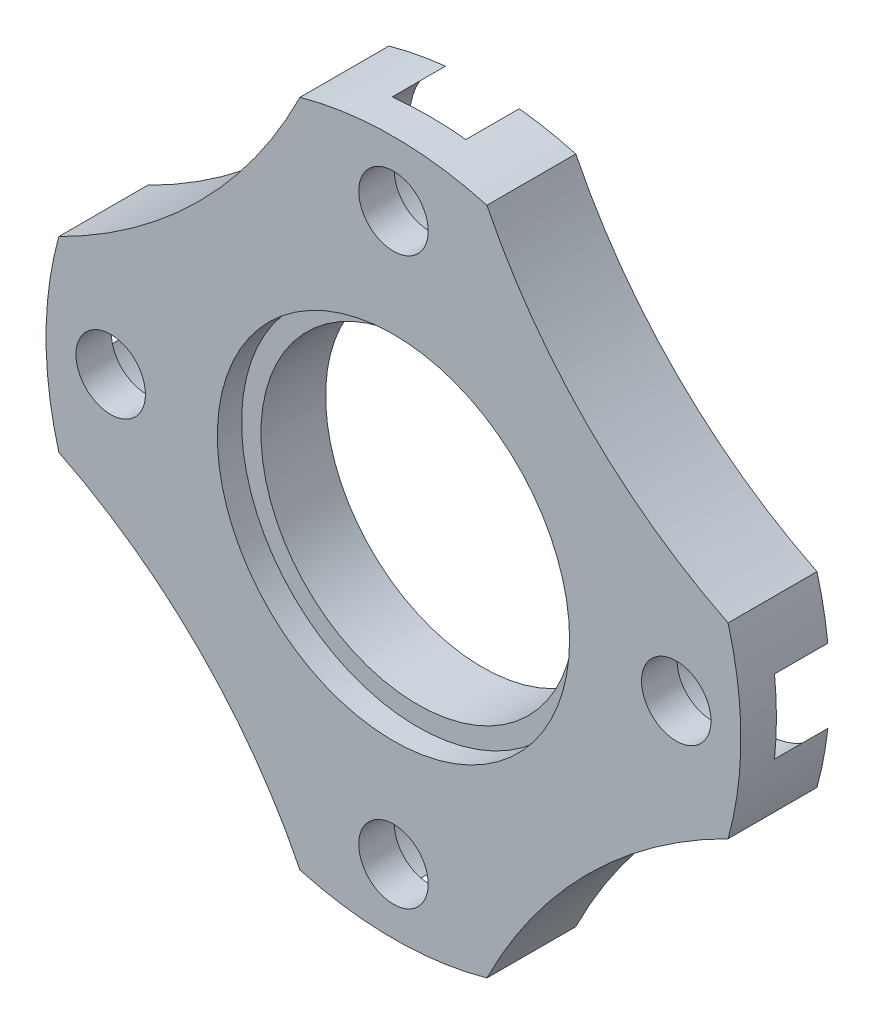
ISO-10303-21;
HEADER;
FILE_DESCRIPTION(('STEP AP214'),'2;1');
FILE_NAME('part.step','',(''),(''),'','','');
FILE_SCHEMA(('AUTOMOTIVE_DESIGN { 1 0 10303 214 1 1 1 1 }'));
ENDSEC;
DATA;
#1=APPLICATION_CONTEXT('core data for automotive mechanical design processes');
#2=APPLICATION_PROTOCOL_DEFINITION('international standard','automotive_design',2000,#1);
#3=PRODUCT_CONTEXT('',#1,'mechanical');
#4=PRODUCT('Part','Part','',(#3));
#5=PRODUCT_RELATED_PRODUCT_CATEGORY('part','',(#4));
#6=PRODUCT_DEFINITION_FORMATION('','',#4);
#7=PRODUCT_DEFINITION_CONTEXT('part definition',#1,'design');
#8=PRODUCT_DEFINITION('design','',#6,#7);
#9=PRODUCT_DEFINITION_SHAPE('','',#8);
#10=(LENGTH_UNIT() NAMED_UNIT(*) SI_UNIT(.MILLI.,.METRE.));
#11=(NAMED_UNIT(*) PLANE_ANGLE_UNIT() SI_UNIT($,.RADIAN.));
#12=(NAMED_UNIT(*) SI_UNIT($,.STERADIAN.) SOLID_ANGLE_UNIT());
#13=UNCERTAINTY_MEASURE_WITH_UNIT(LENGTH_MEASURE(1.E-05),#10,'distance_accuracy_value','');
#14=(GEOMETRIC_REPRESENTATION_CONTEXT(3) GLOBAL_UNCERTAINTY_ASSIGNED_CONTEXT((#13)) GLOBAL_UNIT_ASSIGNED_CONTEXT((#10,
#11,#12)) REPRESENTATION_CONTEXT('',''));
#15=CARTESIAN_POINT('',(0.,0.,0.));
#16=DIRECTION('',(0.,0.,1.));
#17=DIRECTION('',(1.,0.,0.));
#18=AXIS2_PLACEMENT_3D('',#15,#16,#17);
#19=CARTESIAN_POINT('',(0.,17.5,5.5));
#20=DIRECTION('',(0.,0.,-1.));
#21=DIRECTION('',(-1.,0.,0.));
#22=AXIS2_PLACEMENT_3D('',#19,#20,#21);
#23=CYLINDRICAL_SURFACE('',#22,2.15);
#24=CARTESIAN_POINT('',(0.,17.5,5.5));
#25=DIRECTION('',(0.,0.,1.));
#26=DIRECTION('',(1.,0.,0.));
#27=AXIS2_PLACEMENT_3D('',#24,#25,#26);
#28=CIRCLE('',#27,2.15);
#29=CARTESIAN_POINT('',(2.15,17.5,5.5));
#30=VERTEX_POINT('',#29);
#31=EDGE_CURVE('E190',#30,#30,#28,.T.);
#32=ORIENTED_EDGE('',*,*,#31,.T.);
#33=EDGE_LOOP('',(#32));
#34=FACE_BOUND('',#33,.T.);
#35=CARTESIAN_POINT('',(0.,17.5,3.3));
#36=DIRECTION('',(0.,0.,-1.));
#37=DIRECTION('',(-1.,0.,0.));
#38=AXIS2_PLACEMENT_3D('',#35,#36,#37);
#39=CIRCLE('',#38,2.15);
#40=CARTESIAN_POINT('',(-2.15,17.5,3.3));
#41=VERTEX_POINT('',#40);
#42=EDGE_CURVE('E297',#41,#41,#39,.T.);
#43=ORIENTED_EDGE('',*,*,#42,.T.);
#44=EDGE_LOOP('',(#43));
#45=FACE_BOUND('',#44,.T.);
#46=ADVANCED_FACE('F34',(#34,#45),#23,.F.);
#47=CARTESIAN_POINT('',(17.5,0.,5.5));
#48=DIRECTION('',(0.,0.,-1.));
#49=DIRECTION('',(-1.,0.,0.));
#50=AXIS2_PLACEMENT_3D('',#47,#48,#49);
#51=CYLINDRICAL_SURFACE('',#50,2.15);
#52=CARTESIAN_POINT('',(17.5,0.,5.5));
#53=DIRECTION('',(0.,0.,1.));
#54=DIRECTION('',(1.,0.,0.));
#55=AXIS2_PLACEMENT_3D('',#52,#53,#54);
#56=CIRCLE('',#55,2.15);
#57=CARTESIAN_POINT('',(19.65,0.,5.5));
#58=VERTEX_POINT('',#57);
#59=EDGE_CURVE('E197',#58,#58,#56,.T.);
#60=ORIENTED_EDGE('',*,*,#59,.T.);
#61=EDGE_LOOP('',(#60));
#62=FACE_BOUND('',#61,.T.);
#63=CARTESIAN_POINT('',(17.5,0.,3.3));
#64=DIRECTION('',(0.,0.,-1.));
#65=DIRECTION('',(-1.,0.,0.));
#66=AXIS2_PLACEMENT_3D('',#63,#64,#65);
#67=CIRCLE('',#66,2.15);
#68=CARTESIAN_POINT('',(15.35,0.,3.3));
#69=VERTEX_POINT('',#68);
#70=EDGE_CURVE('E294',#69,#69,#67,.T.);
#71=ORIENTED_EDGE('',*,*,#70,.T.);
#72=EDGE_LOOP('',(#71));
#73=FACE_BOUND('',#72,.T.);
#74=ADVANCED_FACE('F336',(#62,#73),#51,.F.);
#75=CARTESIAN_POINT('',(-17.5,0.,5.5));
#76=DIRECTION('',(0.,0.,-1.));
#77=DIRECTION('',(-1.,0.,0.));
#78=AXIS2_PLACEMENT_3D('',#75,#76,#77);
#79=CYLINDRICAL_SURFACE('',#78,2.15);
#80=CARTESIAN_POINT('',(-17.5,0.,5.5));
#81=DIRECTION('',(0.,0.,1.));
#82=DIRECTION('',(1.,0.,0.));
#83=AXIS2_PLACEMENT_3D('',#80,#81,#82);
#84=CIRCLE('',#83,2.15);
#85=CARTESIAN_POINT('',(-15.35,0.,5.5));
#86=VERTEX_POINT('',#85);
#87=EDGE_CURVE('E249',#86,#86,#84,.T.);
#88=ORIENTED_EDGE('',*,*,#87,.T.);
#89=EDGE_LOOP('',(#88));
#90=FACE_BOUND('',#89,.T.);
#91=CARTESIAN_POINT('',(-17.5,0.,3.3));
#92=DIRECTION('',(0.,0.,-1.));
#93=DIRECTION('',(-1.,0.,0.));
#94=AXIS2_PLACEMENT_3D('',#91,#92,#93);
#95=CIRCLE('',#94,2.15);
#96=CARTESIAN_POINT('',(-19.65,0.,3.3));
#97=VERTEX_POINT('',#96);
#98=EDGE_CURVE('E290',#97,#97,#95,.T.);
#99=ORIENTED_EDGE('',*,*,#98,.T.);
#100=EDGE_LOOP('',(#99));
#101=FACE_BOUND('',#100,.T.);
#102=ADVANCED_FACE('F342',(#90,#101),#79,.F.);
#103=CARTESIAN_POINT('',(0.,-17.5,5.5));
#104=DIRECTION('',(0.,0.,-1.));
#105=DIRECTION('',(-1.,0.,0.));
#106=AXIS2_PLACEMENT_3D('',#103,#104,#105);
#107=CYLINDRICAL_SURFACE('',#106,2.15);
#108=CARTESIAN_POINT('',(0.,-17.5,5.5));
#109=DIRECTION('',(0.,0.,1.));
#110=DIRECTION('',(1.,0.,0.));
#111=AXIS2_PLACEMENT_3D('',#108,#109,#110);
#112=CIRCLE('',#111,2.15);
#113=CARTESIAN_POINT('',(2.15,-17.5,5.5));
#114=VERTEX_POINT('',#113);
#115=EDGE_CURVE('E246',#114,#114,#112,.T.);
#116=ORIENTED_EDGE('',*,*,#115,.T.);
#117=EDGE_LOOP('',(#116));
#118=FACE_BOUND('',#117,.T.);
#119=CARTESIAN_POINT('',(0.,-17.5,3.3));
#120=DIRECTION('',(0.,0.,-1.));
#121=DIRECTION('',(-1.,0.,0.));
#122=AXIS2_PLACEMENT_3D('',#119,#120,#121);
#123=CIRCLE('',#122,2.15);
#124=CARTESIAN_POINT('',(-2.15,-17.5,3.3));
#125=VERTEX_POINT('',#124);
#126=EDGE_CURVE('E291',#125,#125,#123,.T.);
#127=ORIENTED_EDGE('',*,*,#126,.T.);
#128=EDGE_LOOP('',(#127));
#129=FACE_BOUND('',#128,.T.);
#130=ADVANCED_FACE('F362',(#118,#129),#107,.F.);
#131=CARTESIAN_POINT('',(0.,0.,5.5));
#132=DIRECTION('',(0.,0.,-1.));
#133=DIRECTION('',(-1.,0.,0.));
#134=AXIS2_PLACEMENT_3D('',#131,#132,#133);
#135=CYLINDRICAL_SURFACE('',#134,21.5);
#136=CARTESIAN_POINT('',(0.,0.,0.));
#137=DIRECTION('',(0.,0.,1.));
#138=DIRECTION('',(1.,0.,0.));
#139=AXIS2_PLACEMENT_3D('',#136,#137,#138);
#140=CIRCLE('',#139,21.5);
#141=CARTESIAN_POINT('',(20.7072263078309,-5.78452924932317,0.));
#142=VERTEX_POINT('',#141);
#143=CARTESIAN_POINT('',(21.3785714285714,-2.28181587194702,0.));
#144=VERTEX_POINT('',#143);
#145=EDGE_CURVE('E173',#142,#144,#140,.T.);
#146=ORIENTED_EDGE('',*,*,#145,.T.);
#147=DIRECTION('',(0.,0.,-1.));
#148=VECTOR('',#147,1.);
#149=CARTESIAN_POINT('',(21.3785714285714,-2.28181587194703,1.65));
#150=LINE('',#149,#148);
#151=CARTESIAN_POINT('',(21.3785714285714,-2.28181587194704,3.3));
#152=VERTEX_POINT('',#151);
#153=EDGE_CURVE('E57',#144,#152,#150,.F.);
#154=ORIENTED_EDGE('',*,*,#153,.T.);
#155=CARTESIAN_POINT('',(0.,0.,3.3));
#156=DIRECTION('',(0.,0.,-1.));
#157=DIRECTION('',(-1.,0.,0.));
#158=AXIS2_PLACEMENT_3D('',#155,#156,#157);
#159=CIRCLE('',#158,21.5);
#160=CARTESIAN_POINT('',(21.3785714285714,2.28181587194704,3.3));
#161=VERTEX_POINT('',#160);
#162=EDGE_CURVE('E295',#161,#152,#159,.T.);
#163=ORIENTED_EDGE('',*,*,#162,.F.);
#164=DIRECTION('',(0.,0.,-1.));
#165=VECTOR('',#164,1.);
#166=CARTESIAN_POINT('',(21.3785714285714,2.28181587194703,1.65));
#167=LINE('',#166,#165);
#168=CARTESIAN_POINT('',(21.3785714285714,2.28181587194703,0.));
#169=VERTEX_POINT('',#168);
#170=EDGE_CURVE('E300',#161,#169,#167,.T.);
#171=ORIENTED_EDGE('',*,*,#170,.T.);
#172=CARTESIAN_POINT('',(20.707226307831,5.78452924932302,0.));
#173=VERTEX_POINT('',#172);
#174=EDGE_CURVE('E179',#169,#173,#140,.T.);
#175=ORIENTED_EDGE('',*,*,#174,.T.);
#176=DIRECTION('',(0.,0.,1.));
#177=VECTOR('',#176,1.);
#178=CARTESIAN_POINT('',(20.707226307831,5.78452924932302,0.));
#179=LINE('',#178,#177);
#180=CARTESIAN_POINT('',(20.707226307831,5.78452924932302,5.5));
#181=VERTEX_POINT('',#180);
#182=EDGE_CURVE('E232',#173,#181,#179,.T.);
#183=ORIENTED_EDGE('',*,*,#182,.T.);
#184=CARTESIAN_POINT('',(0.,0.,5.5));
#185=DIRECTION('',(0.,0.,1.));
#186=DIRECTION('',(1.,0.,0.));
#187=AXIS2_PLACEMENT_3D('',#184,#185,#186);
#188=CIRCLE('',#187,21.5);
#189=CARTESIAN_POINT('',(20.7072263078309,-5.78452924932317,5.5));
#190=VERTEX_POINT('',#189);
#191=EDGE_CURVE('E188',#190,#181,#188,.T.);
#192=ORIENTED_EDGE('',*,*,#191,.F.);
#193=DIRECTION('',(0.,0.,1.));
#194=VECTOR('',#193,1.);
#195=CARTESIAN_POINT('',(20.7072263078309,-5.78452924932317,0.));
#196=LINE('',#195,#194);
#197=EDGE_CURVE('E229',#142,#190,#196,.T.);
#198=ORIENTED_EDGE('',*,*,#197,.F.);
#199=EDGE_LOOP('',(#146,#154,#163,#171,#175,#183,#192,#198));
#200=FACE_BOUND('',#199,.T.);
#201=ADVANCED_FACE('F355',(#200),#135,.T.);
#202=CARTESIAN_POINT('',(-20.707226307831,5.784529249323,0.));
#203=VERTEX_POINT('',#202);
#204=CARTESIAN_POINT('',(-21.3785714285714,2.28181587194702,0.));
#205=VERTEX_POINT('',#204);
#206=EDGE_CURVE('E177',#203,#205,#140,.T.);
#207=ORIENTED_EDGE('',*,*,#206,.T.);
#208=DIRECTION('',(0.,0.,-1.));
#209=VECTOR('',#208,1.);
#210=CARTESIAN_POINT('',(-21.3785714285714,2.28181587194702,1.65));
#211=LINE('',#210,#209);
#212=CARTESIAN_POINT('',(-21.3785714285714,2.28181587194704,3.3));
#213=VERTEX_POINT('',#212);
#214=EDGE_CURVE('E49',#205,#213,#211,.F.);
#215=ORIENTED_EDGE('',*,*,#214,.T.);
#216=CARTESIAN_POINT('',(0.,0.,3.3));
#217=DIRECTION('',(0.,0.,-1.));
#218=DIRECTION('',(-1.,0.,0.));
#219=AXIS2_PLACEMENT_3D('',#216,#217,#218);
#220=CIRCLE('',#219,21.5);
#221=CARTESIAN_POINT('',(-21.3785714285714,-2.28181587194704,3.3));
#222=VERTEX_POINT('',#221);
#223=EDGE_CURVE('E292',#222,#213,#220,.T.);
#224=ORIENTED_EDGE('',*,*,#223,.F.);
#225=DIRECTION('',(0.,0.,-1.));
#226=VECTOR('',#225,1.);
#227=CARTESIAN_POINT('',(-21.3785714285714,-2.28181587194703,1.65));
#228=LINE('',#227,#226);
#229=CARTESIAN_POINT('',(-21.3785714285714,-2.28181587194703,0.));
#230=VERTEX_POINT('',#229);
#231=EDGE_CURVE('E209',#222,#230,#228,.T.);
#232=ORIENTED_EDGE('',*,*,#231,.T.);
#233=CARTESIAN_POINT('',(-20.707226307831,-5.78452924932287,0.));
#234=VERTEX_POINT('',#233);
#235=EDGE_CURVE('E176',#230,#234,#140,.T.);
#236=ORIENTED_EDGE('',*,*,#235,.T.);
#237=DIRECTION('',(0.,0.,1.));
#238=VECTOR('',#237,1.);
#239=CARTESIAN_POINT('',(-20.707226307831,-5.78452924932287,0.));
#240=LINE('',#239,#238);
#241=CARTESIAN_POINT('',(-20.707226307831,-5.78452924932287,5.5));
#242=VERTEX_POINT('',#241);
#243=EDGE_CURVE('E206',#234,#242,#240,.T.);
#244=ORIENTED_EDGE('',*,*,#243,.T.);
#245=CARTESIAN_POINT('',(-20.707226307831,5.78452924932301,5.5));
#246=VERTEX_POINT('',#245);
#247=EDGE_CURVE('E260',#246,#242,#188,.T.);
#248=ORIENTED_EDGE('',*,*,#247,.F.);
#249=DIRECTION('',(0.,0.,1.));
#250=VECTOR('',#249,1.);
#251=CARTESIAN_POINT('',(-20.707226307831,5.78452924932301,0.));
#252=LINE('',#251,#250);
#253=EDGE_CURVE('E269',#203,#246,#252,.T.);
#254=ORIENTED_EDGE('',*,*,#253,.F.);
#255=EDGE_LOOP('',(#207,#215,#224,#232,#236,#244,#248,#254));
#256=FACE_BOUND('',#255,.T.);
#257=ADVANCED_FACE('F204',(#256),#135,.T.);
#258=CARTESIAN_POINT('',(5.78452924932308,20.7072263078309,0.));
#259=VERTEX_POINT('',#258);
#260=CARTESIAN_POINT('',(2.28181587194702,21.3785714285714,0.));
#261=VERTEX_POINT('',#260);
#262=EDGE_CURVE('E180',#259,#261,#140,.T.);
#263=ORIENTED_EDGE('',*,*,#262,.T.);
#264=DIRECTION('',(0.,0.,-1.));
#265=VECTOR('',#264,1.);
#266=CARTESIAN_POINT('',(2.28181587194703,21.3785714285714,1.65));
#267=LINE('',#266,#265);
#268=CARTESIAN_POINT('',(2.28181587194704,21.3785714285714,3.3));
#269=VERTEX_POINT('',#268);
#270=EDGE_CURVE('E307',#261,#269,#267,.F.);
#271=ORIENTED_EDGE('',*,*,#270,.T.);
#272=CARTESIAN_POINT('',(0.,0.,3.3));
#273=DIRECTION('',(0.,0.,-1.));
#274=DIRECTION('',(-1.,0.,0.));
#275=AXIS2_PLACEMENT_3D('',#272,#273,#274);
#276=CIRCLE('',#275,21.5);
#277=CARTESIAN_POINT('',(-2.28181587194704,21.3785714285714,3.3));
#278=VERTEX_POINT('',#277);
#279=EDGE_CURVE('E298',#278,#269,#276,.T.);
#280=ORIENTED_EDGE('',*,*,#279,.F.);
#281=DIRECTION('',(0.,0.,-1.));
#282=VECTOR('',#281,1.);
#283=CARTESIAN_POINT('',(-2.28181587194703,21.3785714285714,1.65));
#284=LINE('',#283,#282);
#285=CARTESIAN_POINT('',(-2.28181587194703,21.3785714285714,0.));
#286=VERTEX_POINT('',#285);
#287=EDGE_CURVE('E305',#278,#286,#284,.T.);
#288=ORIENTED_EDGE('',*,*,#287,.T.);
#289=CARTESIAN_POINT('',(-5.78452924932309,20.7072263078309,0.));
#290=VERTEX_POINT('',#289);
#291=EDGE_CURVE('E175',#286,#290,#140,.T.);
#292=ORIENTED_EDGE('',*,*,#291,.T.);
#293=DIRECTION('',(0.,0.,1.));
#294=VECTOR('',#293,1.);
#295=CARTESIAN_POINT('',(-5.78452924932309,20.7072263078309,0.));
#296=LINE('',#295,#294);
#297=CARTESIAN_POINT('',(-5.78452924932309,20.7072263078309,5.5));
#298=VERTEX_POINT('',#297);
#299=EDGE_CURVE('E222',#290,#298,#296,.T.);
#300=ORIENTED_EDGE('',*,*,#299,.T.);
#301=CARTESIAN_POINT('',(5.78452924932309,20.7072263078309,5.5));
#302=VERTEX_POINT('',#301);
#303=EDGE_CURVE('E165',#302,#298,#188,.T.);
#304=ORIENTED_EDGE('',*,*,#303,.F.);
#305=DIRECTION('',(0.,0.,1.));
#306=VECTOR('',#305,1.);
#307=CARTESIAN_POINT('',(5.78452924932309,20.7072263078309,0.));
#308=LINE('',#307,#306);
#309=EDGE_CURVE('E225',#259,#302,#308,.T.);
#310=ORIENTED_EDGE('',*,*,#309,.F.);
#311=EDGE_LOOP('',(#263,#271,#280,#288,#292,#300,#304,#310));
#312=FACE_BOUND('',#311,.T.);
#313=ADVANCED_FACE('F320',(#312),#135,.T.);
#314=CARTESIAN_POINT('',(0.,0.,5.5));
#315=DIRECTION('',(0.,0.,-1.));
#316=DIRECTION('',(-1.,0.,0.));
#317=AXIS2_PLACEMENT_3D('',#314,#315,#316);
#318=CYLINDRICAL_SURFACE('',#317,9.7);
#319=CARTESIAN_POINT('',(0.,0.,0.));
#320=DIRECTION('',(0.,0.,1.));
#321=DIRECTION('',(1.,0.,0.));
#322=AXIS2_PLACEMENT_3D('',#319,#320,#321);
#323=CIRCLE('',#322,9.7);
#324=CARTESIAN_POINT('',(9.7,0.,0.));
#325=VERTEX_POINT('',#324);
#326=EDGE_CURVE('E243',#325,#325,#323,.T.);
#327=ORIENTED_EDGE('',*,*,#326,.F.);
#328=EDGE_LOOP('',(#327));
#329=FACE_BOUND('',#328,.T.);
#330=CARTESIAN_POINT('',(0.,0.,4.));
#331=DIRECTION('',(0.,0.,1.));
#332=DIRECTION('',(1.,0.,0.));
#333=AXIS2_PLACEMENT_3D('',#330,#331,#332);
#334=CIRCLE('',#333,9.7);
#335=CARTESIAN_POINT('',(9.7,0.,4.));
#336=VERTEX_POINT('',#335);
#337=EDGE_CURVE('E240',#336,#336,#334,.T.);
#338=ORIENTED_EDGE('',*,*,#337,.T.);
#339=EDGE_LOOP('',(#338));
#340=FACE_BOUND('',#339,.T.);
#341=ADVANCED_FACE('F349',(#329,#340),#318,.F.);
#342=CARTESIAN_POINT('',(0.,0.,5.5));
#343=DIRECTION('',(0.,0.,1.));
#344=DIRECTION('',(1.,0.,0.));
#345=AXIS2_PLACEMENT_3D('',#342,#343,#344);
#346=PLANE('',#345);
#347=CARTESIAN_POINT('',(35.3553390593274,35.3553390593273,5.5));
#348=DIRECTION('',(0.,0.,1.));
#349=DIRECTION('',(1.,0.,0.));
#350=AXIS2_PLACEMENT_3D('',#347,#348,#349);
#351=CIRCLE('',#350,33.);
#352=EDGE_CURVE('E217',#302,#181,#351,.T.);
#353=ORIENTED_EDGE('',*,*,#352,.F.);
#354=ORIENTED_EDGE('',*,*,#303,.T.);
#355=CARTESIAN_POINT('',(-35.3553390593274,35.3553390593273,5.5));
#356=DIRECTION('',(0.,0.,1.));
#357=DIRECTION('',(1.,0.,0.));
#358=AXIS2_PLACEMENT_3D('',#355,#356,#357);
#359=CIRCLE('',#358,33.);
#360=EDGE_CURVE('E267',#246,#298,#359,.T.);
#361=ORIENTED_EDGE('',*,*,#360,.F.);
#362=ORIENTED_EDGE('',*,*,#247,.T.);
#363=CARTESIAN_POINT('',(-35.3553390593277,-35.3553390593271,5.5));
#364=DIRECTION('',(0.,0.,1.));
#365=DIRECTION('',(1.,0.,0.));
#366=AXIS2_PLACEMENT_3D('',#363,#364,#365);
#367=CIRCLE('',#366,33.);
#368=CARTESIAN_POINT('',(-5.78452924932322,-20.7072263078309,5.5));
#369=VERTEX_POINT('',#368);
#370=EDGE_CURVE('E216',#369,#242,#367,.T.);
#371=ORIENTED_EDGE('',*,*,#370,.F.);
#372=CARTESIAN_POINT('',(5.78452924932297,-20.707226307831,5.5));
#373=VERTEX_POINT('',#372);
#374=EDGE_CURVE('E254',#369,#373,#188,.T.);
#375=ORIENTED_EDGE('',*,*,#374,.T.);
#376=CARTESIAN_POINT('',(35.3553390593272,-35.3553390593276,5.5));
#377=DIRECTION('',(0.,0.,1.));
#378=DIRECTION('',(1.,0.,0.));
#379=AXIS2_PLACEMENT_3D('',#376,#377,#378);
#380=CIRCLE('',#379,33.);
#381=EDGE_CURVE('E230',#190,#373,#380,.T.);
#382=ORIENTED_EDGE('',*,*,#381,.F.);
#383=ORIENTED_EDGE('',*,*,#191,.T.);
#384=EDGE_LOOP('',(#353,#354,#361,#362,#371,#375,#382,#383));
#385=FACE_BOUND('',#384,.T.);
#386=CARTESIAN_POINT('',(0.,0.,5.5));
#387=DIRECTION('',(0.,0.,1.));
#388=DIRECTION('',(1.,0.,0.));
#389=AXIS2_PLACEMENT_3D('',#386,#387,#388);
#390=CIRCLE('',#389,10.9);
#391=CARTESIAN_POINT('',(10.9,0.,5.5));
#392=VERTEX_POINT('',#391);
#393=EDGE_CURVE('E235',#392,#392,#390,.T.);
#394=ORIENTED_EDGE('',*,*,#393,.F.);
#395=EDGE_LOOP('',(#394));
#396=FACE_BOUND('',#395,.T.);
#397=ORIENTED_EDGE('',*,*,#115,.F.);
#398=EDGE_LOOP('',(#397));
#399=FACE_BOUND('',#398,.T.);
#400=ORIENTED_EDGE('',*,*,#59,.F.);
#401=EDGE_LOOP('',(#400));
#402=FACE_BOUND('',#401,.T.);
#403=ORIENTED_EDGE('',*,*,#31,.F.);
#404=EDGE_LOOP('',(#403));
#405=FACE_BOUND('',#404,.T.);
#406=ORIENTED_EDGE('',*,*,#87,.F.);
#407=EDGE_LOOP('',(#406));
#408=FACE_BOUND('',#407,.T.);
#409=ADVANCED_FACE('F264',(#385,#396,#399,#402,#405,#408),#346,.T.);
#410=CARTESIAN_POINT('',(0.,0.,0.));
#411=DIRECTION('',(0.,0.,1.));
#412=DIRECTION('',(1.,0.,0.));
#413=AXIS2_PLACEMENT_3D('',#410,#411,#412);
#414=PLANE('',#413);
#415=ORIENTED_EDGE('',*,*,#291,.F.);
#416=CARTESIAN_POINT('',(0.,17.5,0.));
#417=DIRECTION('',(0.,0.,-1.));
#418=DIRECTION('',(-1.,0.,0.));
#419=AXIS2_PLACEMENT_3D('',#416,#417,#418);
#420=CIRCLE('',#419,4.5);
#421=EDGE_CURVE('E280',#261,#286,#420,.T.);
#422=ORIENTED_EDGE('',*,*,#421,.F.);
#423=ORIENTED_EDGE('',*,*,#262,.F.);
#424=CARTESIAN_POINT('',(35.3553390593274,35.3553390593273,0.));
#425=DIRECTION('',(0.,0.,1.));
#426=DIRECTION('',(1.,0.,0.));
#427=AXIS2_PLACEMENT_3D('',#424,#425,#426);
#428=CIRCLE('',#427,33.);
#429=EDGE_CURVE('E313',#259,#173,#428,.T.);
#430=ORIENTED_EDGE('',*,*,#429,.T.);
#431=ORIENTED_EDGE('',*,*,#174,.F.);
#432=CARTESIAN_POINT('',(17.5,0.,0.));
#433=DIRECTION('',(0.,0.,-1.));
#434=DIRECTION('',(-1.,0.,0.));
#435=AXIS2_PLACEMENT_3D('',#432,#433,#434);
#436=CIRCLE('',#435,4.5);
#437=EDGE_CURVE('E283',#144,#169,#436,.T.);
#438=ORIENTED_EDGE('',*,*,#437,.F.);
#439=ORIENTED_EDGE('',*,*,#145,.F.);
#440=CARTESIAN_POINT('',(35.3553390593272,-35.3553390593276,0.));
#441=DIRECTION('',(0.,0.,1.));
#442=DIRECTION('',(1.,0.,0.));
#443=AXIS2_PLACEMENT_3D('',#440,#441,#442);
#444=CIRCLE('',#443,33.);
#445=CARTESIAN_POINT('',(5.78452924932297,-20.707226307831,0.));
#446=VERTEX_POINT('',#445);
#447=EDGE_CURVE('E171',#142,#446,#444,.T.);
#448=ORIENTED_EDGE('',*,*,#447,.T.);
#449=CARTESIAN_POINT('',(2.28181587194704,-21.3785714285714,0.));
#450=VERTEX_POINT('',#449);
#451=EDGE_CURVE('E162',#450,#446,#140,.T.);
#452=ORIENTED_EDGE('',*,*,#451,.F.);
#453=CARTESIAN_POINT('',(0.,-17.5,0.));
#454=DIRECTION('',(0.,0.,-1.));
#455=DIRECTION('',(-1.,0.,0.));
#456=AXIS2_PLACEMENT_3D('',#453,#454,#455);
#457=CIRCLE('',#456,4.5);
#458=CARTESIAN_POINT('',(-2.28181587194703,-21.3785714285714,0.));
#459=VERTEX_POINT('',#458);
#460=EDGE_CURVE('E149',#459,#450,#457,.T.);
#461=ORIENTED_EDGE('',*,*,#460,.F.);
#462=CARTESIAN_POINT('',(-5.78452924932322,-20.7072263078309,0.));
#463=VERTEX_POINT('',#462);
#464=EDGE_CURVE('E172',#463,#459,#140,.T.);
#465=ORIENTED_EDGE('',*,*,#464,.F.);
#466=CARTESIAN_POINT('',(-35.3553390593277,-35.3553390593271,0.));
#467=DIRECTION('',(0.,0.,1.));
#468=DIRECTION('',(1.,0.,0.));
#469=AXIS2_PLACEMENT_3D('',#466,#467,#468);
#470=CIRCLE('',#469,33.);
#471=EDGE_CURVE('E213',#463,#234,#470,.T.);
#472=ORIENTED_EDGE('',*,*,#471,.T.);
#473=ORIENTED_EDGE('',*,*,#235,.F.);
#474=CARTESIAN_POINT('',(-17.5,0.,0.));
#475=DIRECTION('',(0.,0.,-1.));
#476=DIRECTION('',(-1.,0.,0.));
#477=AXIS2_PLACEMENT_3D('',#474,#475,#476);
#478=CIRCLE('',#477,4.5);
#479=EDGE_CURVE('E275',#205,#230,#478,.T.);
#480=ORIENTED_EDGE('',*,*,#479,.F.);
#481=ORIENTED_EDGE('',*,*,#206,.F.);
#482=CARTESIAN_POINT('',(-35.3553390593274,35.3553390593273,0.));
#483=DIRECTION('',(0.,0.,1.));
#484=DIRECTION('',(1.,0.,0.));
#485=AXIS2_PLACEMENT_3D('',#482,#483,#484);
#486=CIRCLE('',#485,33.);
#487=EDGE_CURVE('E272',#203,#290,#486,.T.);
#488=ORIENTED_EDGE('',*,*,#487,.T.);
#489=EDGE_LOOP('',(#415,#422,#423,#430,#431,#438,#439,#448,#452,#461,#465,#472,#473,#480,#481,#488));
#490=FACE_BOUND('',#489,.T.);
#491=ORIENTED_EDGE('',*,*,#326,.T.);
#492=EDGE_LOOP('',(#491));
#493=FACE_BOUND('',#492,.T.);
#494=ADVANCED_FACE('F168',(#490,#493),#414,.F.);
#495=ORIENTED_EDGE('',*,*,#464,.T.);
#496=DIRECTION('',(0.,0.,-1.));
#497=VECTOR('',#496,1.);
#498=CARTESIAN_POINT('',(-2.28181587194702,-21.3785714285714,1.65));
#499=LINE('',#498,#497);
#500=CARTESIAN_POINT('',(-2.28181587194703,-21.3785714285714,3.3));
#501=VERTEX_POINT('',#500);
#502=EDGE_CURVE('E11',#459,#501,#499,.F.);
#503=ORIENTED_EDGE('',*,*,#502,.T.);
#504=CARTESIAN_POINT('',(0.,0.,3.3));
#505=DIRECTION('',(0.,0.,-1.));
#506=DIRECTION('',(-1.,0.,0.));
#507=AXIS2_PLACEMENT_3D('',#504,#505,#506);
#508=CIRCLE('',#507,21.5);
#509=CARTESIAN_POINT('',(2.28181587194704,-21.3785714285714,3.3));
#510=VERTEX_POINT('',#509);
#511=EDGE_CURVE('E164',#510,#501,#508,.T.);
#512=ORIENTED_EDGE('',*,*,#511,.F.);
#513=DIRECTION('',(0.,0.,-1.));
#514=VECTOR('',#513,1.);
#515=CARTESIAN_POINT('',(2.28181587194703,-21.3785714285714,1.65));
#516=LINE('',#515,#514);
#517=EDGE_CURVE('E42',#510,#450,#516,.T.);
#518=ORIENTED_EDGE('',*,*,#517,.T.);
#519=ORIENTED_EDGE('',*,*,#451,.T.);
#520=DIRECTION('',(0.,0.,1.));
#521=VECTOR('',#520,1.);
#522=CARTESIAN_POINT('',(5.78452924932297,-20.707226307831,0.));
#523=LINE('',#522,#521);
#524=EDGE_CURVE('E233',#446,#373,#523,.T.);
#525=ORIENTED_EDGE('',*,*,#524,.T.);
#526=ORIENTED_EDGE('',*,*,#374,.F.);
#527=DIRECTION('',(0.,0.,1.));
#528=VECTOR('',#527,1.);
#529=CARTESIAN_POINT('',(-5.78452924932322,-20.7072263078309,0.));
#530=LINE('',#529,#528);
#531=EDGE_CURVE('E218',#463,#369,#530,.T.);
#532=ORIENTED_EDGE('',*,*,#531,.F.);
#533=EDGE_LOOP('',(#495,#503,#512,#518,#519,#525,#526,#532));
#534=FACE_BOUND('',#533,.T.);
#535=ADVANCED_FACE('F36',(#534),#135,.T.);
#536=CARTESIAN_POINT('',(0.,0.,4.));
#537=DIRECTION('',(0.,0.,1.));
#538=DIRECTION('',(1.,0.,0.));
#539=AXIS2_PLACEMENT_3D('',#536,#537,#538);
#540=CYLINDRICAL_SURFACE('',#539,10.9);
#541=CARTESIAN_POINT('',(0.,0.,4.));
#542=DIRECTION('',(0.,0.,1.));
#543=DIRECTION('',(1.,0.,0.));
#544=AXIS2_PLACEMENT_3D('',#541,#542,#543);
#545=CIRCLE('',#544,10.9);
#546=CARTESIAN_POINT('',(10.9,0.,4.));
#547=VERTEX_POINT('',#546);
#548=EDGE_CURVE('E237',#547,#547,#545,.T.);
#549=ORIENTED_EDGE('',*,*,#548,.F.);
#550=EDGE_LOOP('',(#549));
#551=FACE_BOUND('',#550,.T.);
#552=ORIENTED_EDGE('',*,*,#393,.T.);
#553=EDGE_LOOP('',(#552));
#554=FACE_BOUND('',#553,.T.);
#555=ADVANCED_FACE('F354',(#551,#554),#540,.F.);
#556=CARTESIAN_POINT('',(0.,0.,4.));
#557=DIRECTION('',(0.,0.,1.));
#558=DIRECTION('',(1.,0.,0.));
#559=AXIS2_PLACEMENT_3D('',#556,#557,#558);
#560=PLANE('',#559);
#561=ORIENTED_EDGE('',*,*,#337,.F.);
#562=EDGE_LOOP('',(#561));
#563=FACE_BOUND('',#562,.T.);
#564=ORIENTED_EDGE('',*,*,#548,.T.);
#565=EDGE_LOOP('',(#564));
#566=FACE_BOUND('',#565,.T.);
#567=ADVANCED_FACE('F330',(#563,#566),#560,.T.);
#568=CARTESIAN_POINT('',(35.3553390593272,-35.3553390593276,0.));
#569=DIRECTION('',(0.,0.,1.));
#570=DIRECTION('',(1.,0.,0.));
#571=AXIS2_PLACEMENT_3D('',#568,#569,#570);
#572=CYLINDRICAL_SURFACE('',#571,33.);
#573=ORIENTED_EDGE('',*,*,#381,.T.);
#574=ORIENTED_EDGE('',*,*,#524,.F.);
#575=ORIENTED_EDGE('',*,*,#447,.F.);
#576=ORIENTED_EDGE('',*,*,#197,.T.);
#577=EDGE_LOOP('',(#573,#574,#575,#576));
#578=FACE_BOUND('',#577,.T.);
#579=ADVANCED_FACE('F323',(#578),#572,.F.);
#580=CARTESIAN_POINT('',(-35.3553390593274,35.3553390593273,0.));
#581=DIRECTION('',(0.,0.,1.));
#582=DIRECTION('',(1.,0.,0.));
#583=AXIS2_PLACEMENT_3D('',#580,#581,#582);
#584=CYLINDRICAL_SURFACE('',#583,33.);
#585=ORIENTED_EDGE('',*,*,#360,.T.);
#586=ORIENTED_EDGE('',*,*,#299,.F.);
#587=ORIENTED_EDGE('',*,*,#487,.F.);
#588=ORIENTED_EDGE('',*,*,#253,.T.);
#589=EDGE_LOOP('',(#585,#586,#587,#588));
#590=FACE_BOUND('',#589,.T.);
#591=ADVANCED_FACE('F321',(#590),#584,.F.);
#592=CARTESIAN_POINT('',(-35.3553390593277,-35.3553390593271,0.));
#593=DIRECTION('',(0.,0.,1.));
#594=DIRECTION('',(1.,0.,0.));
#595=AXIS2_PLACEMENT_3D('',#592,#593,#594);
#596=CYLINDRICAL_SURFACE('',#595,33.);
#597=ORIENTED_EDGE('',*,*,#370,.T.);
#598=ORIENTED_EDGE('',*,*,#243,.F.);
#599=ORIENTED_EDGE('',*,*,#471,.F.);
#600=ORIENTED_EDGE('',*,*,#531,.T.);
#601=EDGE_LOOP('',(#597,#598,#599,#600));
#602=FACE_BOUND('',#601,.T.);
#603=ADVANCED_FACE('F212',(#602),#596,.F.);
#604=CARTESIAN_POINT('',(35.3553390593274,35.3553390593273,0.));
#605=DIRECTION('',(0.,0.,1.));
#606=DIRECTION('',(1.,0.,0.));
#607=AXIS2_PLACEMENT_3D('',#604,#605,#606);
#608=CYLINDRICAL_SURFACE('',#607,33.);
#609=ORIENTED_EDGE('',*,*,#352,.T.);
#610=ORIENTED_EDGE('',*,*,#182,.F.);
#611=ORIENTED_EDGE('',*,*,#429,.F.);
#612=ORIENTED_EDGE('',*,*,#309,.T.);
#613=EDGE_LOOP('',(#609,#610,#611,#612));
#614=FACE_BOUND('',#613,.T.);
#615=ADVANCED_FACE('F318',(#614),#608,.F.);
#616=CARTESIAN_POINT('',(0.,-17.5,3.3));
#617=DIRECTION('',(0.,0.,-1.));
#618=DIRECTION('',(-1.,0.,0.));
#619=AXIS2_PLACEMENT_3D('',#616,#617,#618);
#620=CYLINDRICAL_SURFACE('',#619,4.5);
#621=ORIENTED_EDGE('',*,*,#460,.T.);
#622=ORIENTED_EDGE('',*,*,#517,.F.);
#623=CARTESIAN_POINT('',(0.,-17.5,3.3));
#624=DIRECTION('',(0.,0.,-1.));
#625=DIRECTION('',(-1.,0.,0.));
#626=AXIS2_PLACEMENT_3D('',#623,#624,#625);
#627=CIRCLE('',#626,4.5);
#628=EDGE_CURVE('E158',#501,#510,#627,.T.);
#629=ORIENTED_EDGE('',*,*,#628,.F.);
#630=ORIENTED_EDGE('',*,*,#502,.F.);
#631=EDGE_LOOP('',(#621,#622,#629,#630));
#632=FACE_BOUND('',#631,.T.);
#633=ADVANCED_FACE('F151',(#632),#620,.F.);
#634=CARTESIAN_POINT('',(0.,-17.5,3.3));
#635=DIRECTION('',(0.,0.,-1.));
#636=DIRECTION('',(-1.,0.,0.));
#637=AXIS2_PLACEMENT_3D('',#634,#635,#636);
#638=PLANE('',#637);
#639=ORIENTED_EDGE('',*,*,#126,.F.);
#640=EDGE_LOOP('',(#639));
#641=FACE_BOUND('',#640,.T.);
#642=ORIENTED_EDGE('',*,*,#511,.T.);
#643=ORIENTED_EDGE('',*,*,#628,.T.);
#644=EDGE_LOOP('',(#642,#643));
#645=FACE_BOUND('',#644,.T.);
#646=ADVANCED_FACE('F472',(#641,#645),#638,.T.);
#647=CARTESIAN_POINT('',(-17.5,0.,3.3));
#648=DIRECTION('',(0.,0.,-1.));
#649=DIRECTION('',(-1.,0.,0.));
#650=AXIS2_PLACEMENT_3D('',#647,#648,#649);
#651=CYLINDRICAL_SURFACE('',#650,4.5);
#652=ORIENTED_EDGE('',*,*,#479,.T.);
#653=ORIENTED_EDGE('',*,*,#231,.F.);
#654=CARTESIAN_POINT('',(-17.5,0.,3.3));
#655=DIRECTION('',(0.,0.,-1.));
#656=DIRECTION('',(-1.,0.,0.));
#657=AXIS2_PLACEMENT_3D('',#654,#655,#656);
#658=CIRCLE('',#657,4.5);
#659=EDGE_CURVE('E276',#213,#222,#658,.T.);
#660=ORIENTED_EDGE('',*,*,#659,.F.);
#661=ORIENTED_EDGE('',*,*,#214,.F.);
#662=EDGE_LOOP('',(#652,#653,#660,#661));
#663=FACE_BOUND('',#662,.T.);
#664=ADVANCED_FACE('F480',(#663),#651,.F.);
#665=CARTESIAN_POINT('',(-17.5,0.,3.3));
#666=DIRECTION('',(0.,0.,-1.));
#667=DIRECTION('',(-1.,0.,0.));
#668=AXIS2_PLACEMENT_3D('',#665,#666,#667);
#669=PLANE('',#668);
#670=ORIENTED_EDGE('',*,*,#98,.F.);
#671=EDGE_LOOP('',(#670));
#672=FACE_BOUND('',#671,.T.);
#673=ORIENTED_EDGE('',*,*,#223,.T.);
#674=ORIENTED_EDGE('',*,*,#659,.T.);
#675=EDGE_LOOP('',(#673,#674));
#676=FACE_BOUND('',#675,.T.);
#677=ADVANCED_FACE('F490',(#672,#676),#669,.T.);
#678=CARTESIAN_POINT('',(17.5,0.,3.3));
#679=DIRECTION('',(0.,0.,-1.));
#680=DIRECTION('',(-1.,0.,0.));
#681=AXIS2_PLACEMENT_3D('',#678,#679,#680);
#682=CYLINDRICAL_SURFACE('',#681,4.5);
#683=ORIENTED_EDGE('',*,*,#437,.T.);
#684=ORIENTED_EDGE('',*,*,#170,.F.);
#685=CARTESIAN_POINT('',(17.5,0.,3.3));
#686=DIRECTION('',(0.,0.,-1.));
#687=DIRECTION('',(-1.,0.,0.));
#688=AXIS2_PLACEMENT_3D('',#685,#686,#687);
#689=CIRCLE('',#688,4.5);
#690=EDGE_CURVE('E277',#152,#161,#689,.T.);
#691=ORIENTED_EDGE('',*,*,#690,.F.);
#692=ORIENTED_EDGE('',*,*,#153,.F.);
#693=EDGE_LOOP('',(#683,#684,#691,#692));
#694=FACE_BOUND('',#693,.T.);
#695=ADVANCED_FACE('F499',(#694),#682,.F.);
#696=CARTESIAN_POINT('',(17.5,0.,3.3));
#697=DIRECTION('',(0.,0.,-1.));
#698=DIRECTION('',(-1.,0.,0.));
#699=AXIS2_PLACEMENT_3D('',#696,#697,#698);
#700=PLANE('',#699);
#701=ORIENTED_EDGE('',*,*,#70,.F.);
#702=EDGE_LOOP('',(#701));
#703=FACE_BOUND('',#702,.T.);
#704=ORIENTED_EDGE('',*,*,#162,.T.);
#705=ORIENTED_EDGE('',*,*,#690,.T.);
#706=EDGE_LOOP('',(#704,#705));
#707=FACE_BOUND('',#706,.T.);
#708=ADVANCED_FACE('F509',(#703,#707),#700,.T.);
#709=CARTESIAN_POINT('',(0.,17.5,3.3));
#710=DIRECTION('',(0.,0.,-1.));
#711=DIRECTION('',(-1.,0.,0.));
#712=AXIS2_PLACEMENT_3D('',#709,#710,#711);
#713=CYLINDRICAL_SURFACE('',#712,4.5);
#714=ORIENTED_EDGE('',*,*,#421,.T.);
#715=ORIENTED_EDGE('',*,*,#287,.F.);
#716=CARTESIAN_POINT('',(0.,17.5,3.3));
#717=DIRECTION('',(0.,0.,-1.));
#718=DIRECTION('',(-1.,0.,0.));
#719=AXIS2_PLACEMENT_3D('',#716,#717,#718);
#720=CIRCLE('',#719,4.5);
#721=EDGE_CURVE('E548',#269,#278,#720,.T.);
#722=ORIENTED_EDGE('',*,*,#721,.F.);
#723=ORIENTED_EDGE('',*,*,#270,.F.);
#724=EDGE_LOOP('',(#714,#715,#722,#723));
#725=FACE_BOUND('',#724,.T.);
#726=ADVANCED_FACE('F518',(#725),#713,.F.);
#727=CARTESIAN_POINT('',(0.,17.5,3.3));
#728=DIRECTION('',(0.,0.,-1.));
#729=DIRECTION('',(-1.,0.,0.));
#730=AXIS2_PLACEMENT_3D('',#727,#728,#729);
#731=PLANE('',#730);
#732=ORIENTED_EDGE('',*,*,#42,.F.);
#733=EDGE_LOOP('',(#732));
#734=FACE_BOUND('',#733,.T.);
#735=ORIENTED_EDGE('',*,*,#279,.T.);
#736=ORIENTED_EDGE('',*,*,#721,.T.);
#737=EDGE_LOOP('',(#735,#736));
#738=FACE_BOUND('',#737,.T.);
#739=ADVANCED_FACE('F528',(#734,#738),#731,.T.);
#740=CLOSED_SHELL('',(#46,#74,#102,#130,#201,#257,#313,#341,#409,#494,#535,#555,#567,#579,#591,
#603,#615,#633,#646,#664,#677,#695,#708,#726,#739));
#741=MANIFOLD_SOLID_BREP('B2',#740);
#742=ADVANCED_BREP_SHAPE_REPRESENTATION('',(#18,#741),#14);
#743=SHAPE_DEFINITION_REPRESENTATION(#9,#742);
ENDSEC;
END-ISO-10303-21;
